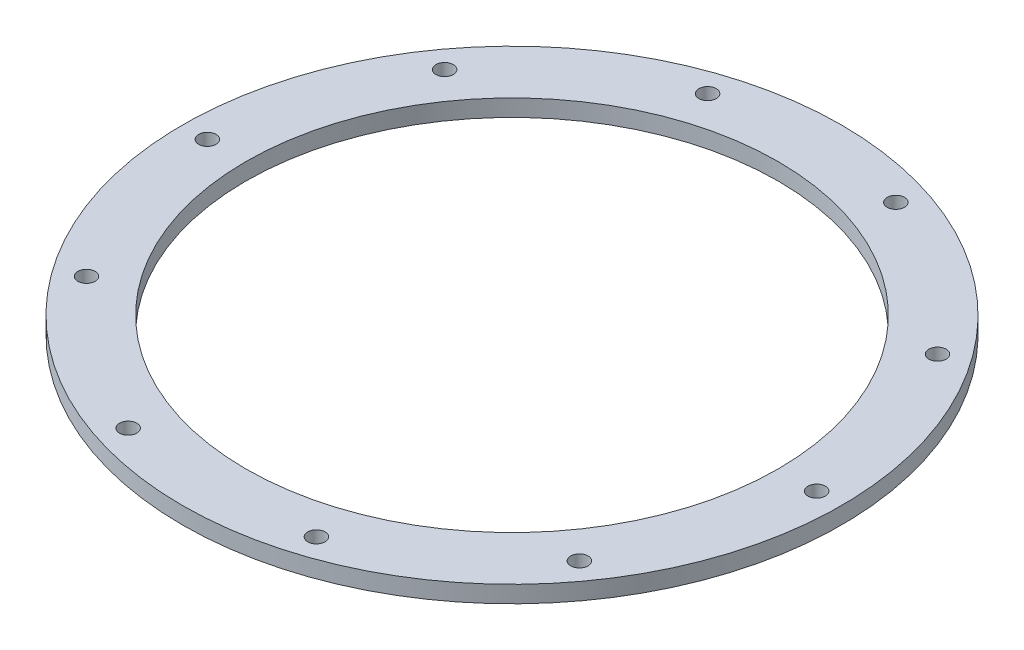
ISO-10303-21;
HEADER;
FILE_DESCRIPTION(('STEP AP214'),'2;1');
FILE_NAME('part.step','',(''),(''),'','','');
FILE_SCHEMA(('AUTOMOTIVE_DESIGN { 1 0 10303 214 1 1 1 1 }'));
ENDSEC;
DATA;
#1=APPLICATION_CONTEXT('core data for automotive mechanical design processes');
#2=APPLICATION_PROTOCOL_DEFINITION('international standard','automotive_design',2000,#1);
#3=PRODUCT_CONTEXT('',#1,'mechanical');
#4=PRODUCT('Part','Part','',(#3));
#5=PRODUCT_RELATED_PRODUCT_CATEGORY('part','',(#4));
#6=PRODUCT_DEFINITION_FORMATION('','',#4);
#7=PRODUCT_DEFINITION_CONTEXT('part definition',#1,'design');
#8=PRODUCT_DEFINITION('design','',#6,#7);
#9=PRODUCT_DEFINITION_SHAPE('','',#8);
#10=(LENGTH_UNIT() NAMED_UNIT(*) SI_UNIT(.MILLI.,.METRE.));
#11=(NAMED_UNIT(*) PLANE_ANGLE_UNIT() SI_UNIT($,.RADIAN.));
#12=(NAMED_UNIT(*) SI_UNIT($,.STERADIAN.) SOLID_ANGLE_UNIT());
#13=UNCERTAINTY_MEASURE_WITH_UNIT(LENGTH_MEASURE(1.E-05),#10,'distance_accuracy_value','');
#14=(GEOMETRIC_REPRESENTATION_CONTEXT(3) GLOBAL_UNCERTAINTY_ASSIGNED_CONTEXT((#13)) GLOBAL_UNIT_ASSIGNED_CONTEXT((#10,
#11,#12)) REPRESENTATION_CONTEXT('',''));
#15=CARTESIAN_POINT('',(0.,0.,0.));
#16=DIRECTION('',(0.,0.,1.));
#17=DIRECTION('',(1.,0.,0.));
#18=AXIS2_PLACEMENT_3D('',#15,#16,#17);
#19=CARTESIAN_POINT('',(0.,4.,0.));
#20=DIRECTION('',(0.,1.,0.));
#21=DIRECTION('',(0.,0.,1.));
#22=AXIS2_PLACEMENT_3D('',#19,#20,#21);
#23=PLANE('',#22);
#24=CARTESIAN_POINT('',(-58.3301252944343,4.,42.3793166902865));
#25=DIRECTION('',(0.,1.,0.));
#26=DIRECTION('',(0.587785252292462,0.,0.809016994374955));
#27=AXIS2_PLACEMENT_3D('',#24,#25,#26);
#28=CIRCLE('',#27,2.04999999999999);
#29=CARTESIAN_POINT('',(-57.1251655272347,4.,44.0378015287552));
#30=VERTEX_POINT('',#29);
#31=EDGE_CURVE('E63',#30,#30,#28,.T.);
#32=ORIENTED_EDGE('',*,*,#31,.F.);
#33=EDGE_LOOP('',(#32));
#34=FACE_BOUND('',#33,.T.);
#35=CARTESIAN_POINT('',(-22.2801252944345,4.,68.5711748248803));
#36=DIRECTION('',(0.,1.,0.));
#37=DIRECTION('',(0.95105651629515,0.,0.309016994374958));
#38=AXIS2_PLACEMENT_3D('',#35,#36,#37);
#39=CIRCLE('',#38,2.04999999999999);
#40=CARTESIAN_POINT('',(-20.3304594360294,4.,69.204659663349));
#41=VERTEX_POINT('',#40);
#42=EDGE_CURVE('E69',#41,#41,#39,.T.);
#43=ORIENTED_EDGE('',*,*,#42,.F.);
#44=EDGE_LOOP('',(#43));
#45=FACE_BOUND('',#44,.T.);
#46=CARTESIAN_POINT('',(22.280125294433,4.,68.5711748248808));
#47=DIRECTION('',(0.,1.,0.));
#48=DIRECTION('',(0.951056516295157,0.,-0.309016994374938));
#49=AXIS2_PLACEMENT_3D('',#46,#47,#48);
#50=CIRCLE('',#49,2.04999999999999);
#51=CARTESIAN_POINT('',(24.2297911528381,4.,67.9376899864122));
#52=VERTEX_POINT('',#51);
#53=EDGE_CURVE('E75',#52,#52,#50,.T.);
#54=ORIENTED_EDGE('',*,*,#53,.F.);
#55=EDGE_LOOP('',(#54));
#56=FACE_BOUND('',#55,.T.);
#57=CARTESIAN_POINT('',(58.3301252944333,4.,42.3793166902878));
#58=DIRECTION('',(0.,1.,0.));
#59=DIRECTION('',(0.58778525229248,0.,-0.809016994374942));
#60=AXIS2_PLACEMENT_3D('',#57,#58,#59);
#61=CIRCLE('',#60,2.04999999999999);
#62=CARTESIAN_POINT('',(59.5350850616329,4.,40.7208318518192));
#63=VERTEX_POINT('',#62);
#64=EDGE_CURVE('E81',#63,#63,#61,.T.);
#65=ORIENTED_EDGE('',*,*,#64,.F.);
#66=EDGE_LOOP('',(#65));
#67=FACE_BOUND('',#66,.T.);
#68=CARTESIAN_POINT('',(72.1,4.,0.));
#69=DIRECTION('',(0.,1.,0.));
#70=DIRECTION('',(0.,0.,-1.));
#71=AXIS2_PLACEMENT_3D('',#68,#69,#70);
#72=CIRCLE('',#71,2.04999999999999);
#73=CARTESIAN_POINT('',(72.1,4.,-2.04999999999999));
#74=VERTEX_POINT('',#73);
#75=EDGE_CURVE('E87',#74,#74,#72,.T.);
#76=ORIENTED_EDGE('',*,*,#75,.F.);
#77=EDGE_LOOP('',(#76));
#78=FACE_BOUND('',#77,.T.);
#79=CARTESIAN_POINT('',(58.3301252944339,4.,-42.379316690287));
#80=DIRECTION('',(0.,1.,0.));
#81=DIRECTION('',(-0.587785252292469,0.,-0.809016994374951));
#82=AXIS2_PLACEMENT_3D('',#79,#80,#81);
#83=CIRCLE('',#82,2.04999999999999);
#84=CARTESIAN_POINT('',(57.1251655272344,4.,-44.0378015287556));
#85=VERTEX_POINT('',#84);
#86=EDGE_CURVE('E93',#85,#85,#83,.T.);
#87=ORIENTED_EDGE('',*,*,#86,.F.);
#88=EDGE_LOOP('',(#87));
#89=FACE_BOUND('',#88,.T.);
#90=CARTESIAN_POINT('',(22.280125294434,4.,-68.5711748248805));
#91=DIRECTION('',(0.,1.,0.));
#92=DIRECTION('',(-0.951056516295152,0.,-0.309016994374952));
#93=AXIS2_PLACEMENT_3D('',#90,#91,#92);
#94=CIRCLE('',#93,2.04999999999999);
#95=CARTESIAN_POINT('',(20.330459436029,4.,-69.2046596633491));
#96=VERTEX_POINT('',#95);
#97=EDGE_CURVE('E99',#96,#96,#94,.T.);
#98=ORIENTED_EDGE('',*,*,#97,.F.);
#99=EDGE_LOOP('',(#98));
#100=FACE_BOUND('',#99,.T.);
#101=CARTESIAN_POINT('',(-22.2801252944335,4.,-68.5711748248806));
#102=DIRECTION('',(0.,1.,0.));
#103=DIRECTION('',(-0.951056516295155,0.,0.309016994374945));
#104=AXIS2_PLACEMENT_3D('',#101,#102,#103);
#105=CIRCLE('',#104,2.04999999999999);
#106=CARTESIAN_POINT('',(-24.2297911528386,4.,-67.937689986412));
#107=VERTEX_POINT('',#106);
#108=EDGE_CURVE('E105',#107,#107,#105,.T.);
#109=ORIENTED_EDGE('',*,*,#108,.F.);
#110=EDGE_LOOP('',(#109));
#111=FACE_BOUND('',#110,.T.);
#112=CARTESIAN_POINT('',(-58.3301252944337,4.,-42.3793166902874));
#113=DIRECTION('',(0.,1.,0.));
#114=DIRECTION('',(-0.587785252292474,0.,0.809016994374947));
#115=AXIS2_PLACEMENT_3D('',#112,#113,#114);
#116=CIRCLE('',#115,2.04999999999999);
#117=CARTESIAN_POINT('',(-59.5350850616332,4.,-40.7208318518188));
#118=VERTEX_POINT('',#117);
#119=EDGE_CURVE('E57',#118,#118,#116,.T.);
#120=ORIENTED_EDGE('',*,*,#119,.F.);
#121=EDGE_LOOP('',(#120));
#122=FACE_BOUND('',#121,.T.);
#123=CARTESIAN_POINT('',(-72.1,4.,0.));
#124=DIRECTION('',(0.,1.,0.));
#125=DIRECTION('',(0.,0.,1.));
#126=AXIS2_PLACEMENT_3D('',#123,#124,#125);
#127=CIRCLE('',#126,2.04999999999999);
#128=CARTESIAN_POINT('',(-72.1,4.,2.04999999999999));
#129=VERTEX_POINT('',#128);
#130=EDGE_CURVE('E51',#129,#129,#127,.T.);
#131=ORIENTED_EDGE('',*,*,#130,.F.);
#132=EDGE_LOOP('',(#131));
#133=FACE_BOUND('',#132,.T.);
#134=CARTESIAN_POINT('',(0.,4.,0.));
#135=DIRECTION('',(0.,1.,0.));
#136=DIRECTION('',(0.,0.,1.));
#137=AXIS2_PLACEMENT_3D('',#134,#135,#136);
#138=CIRCLE('',#137,78.);
#139=CARTESIAN_POINT('',(0.,4.,78.));
#140=VERTEX_POINT('',#139);
#141=EDGE_CURVE('E10',#140,#140,#138,.T.);
#142=ORIENTED_EDGE('',*,*,#141,.T.);
#143=EDGE_LOOP('',(#142));
#144=FACE_BOUND('',#143,.T.);
#145=CARTESIAN_POINT('',(0.,4.,0.));
#146=DIRECTION('',(0.,1.,0.));
#147=DIRECTION('',(0.,0.,1.));
#148=AXIS2_PLACEMENT_3D('',#145,#146,#147);
#149=CIRCLE('',#148,63.);
#150=CARTESIAN_POINT('',(0.,4.,63.));
#151=VERTEX_POINT('',#150);
#152=EDGE_CURVE('E43',#151,#151,#149,.T.);
#153=ORIENTED_EDGE('',*,*,#152,.F.);
#154=EDGE_LOOP('',(#153));
#155=FACE_BOUND('',#154,.T.);
#156=ADVANCED_FACE('F32',(#34,#45,#56,#67,#78,#89,#100,#111,#122,#133,#144,#155),#23,.T.);
#157=CARTESIAN_POINT('',(0.,0.,0.));
#158=DIRECTION('',(0.,1.,0.));
#159=DIRECTION('',(0.,0.,1.));
#160=AXIS2_PLACEMENT_3D('',#157,#158,#159);
#161=PLANE('',#160);
#162=CARTESIAN_POINT('',(-58.3301252944343,0.,42.3793166902865));
#163=DIRECTION('',(0.,1.,0.));
#164=DIRECTION('',(0.587785252292462,0.,0.809016994374955));
#165=AXIS2_PLACEMENT_3D('',#162,#163,#164);
#166=CIRCLE('',#165,2.04999999999999);
#167=CARTESIAN_POINT('',(-57.1251655272347,0.,44.0378015287552));
#168=VERTEX_POINT('',#167);
#169=EDGE_CURVE('E66',#168,#168,#166,.T.);
#170=ORIENTED_EDGE('',*,*,#169,.T.);
#171=EDGE_LOOP('',(#170));
#172=FACE_BOUND('',#171,.T.);
#173=CARTESIAN_POINT('',(-22.2801252944345,0.,68.5711748248803));
#174=DIRECTION('',(0.,1.,0.));
#175=DIRECTION('',(0.95105651629515,0.,0.309016994374958));
#176=AXIS2_PLACEMENT_3D('',#173,#174,#175);
#177=CIRCLE('',#176,2.04999999999999);
#178=CARTESIAN_POINT('',(-20.3304594360294,0.,69.204659663349));
#179=VERTEX_POINT('',#178);
#180=EDGE_CURVE('E72',#179,#179,#177,.T.);
#181=ORIENTED_EDGE('',*,*,#180,.T.);
#182=EDGE_LOOP('',(#181));
#183=FACE_BOUND('',#182,.T.);
#184=CARTESIAN_POINT('',(22.280125294433,0.,68.5711748248808));
#185=DIRECTION('',(0.,1.,0.));
#186=DIRECTION('',(0.951056516295157,0.,-0.309016994374938));
#187=AXIS2_PLACEMENT_3D('',#184,#185,#186);
#188=CIRCLE('',#187,2.04999999999999);
#189=CARTESIAN_POINT('',(24.2297911528381,0.,67.9376899864122));
#190=VERTEX_POINT('',#189);
#191=EDGE_CURVE('E78',#190,#190,#188,.T.);
#192=ORIENTED_EDGE('',*,*,#191,.T.);
#193=EDGE_LOOP('',(#192));
#194=FACE_BOUND('',#193,.T.);
#195=CARTESIAN_POINT('',(58.3301252944333,0.,42.3793166902878));
#196=DIRECTION('',(0.,1.,0.));
#197=DIRECTION('',(0.58778525229248,0.,-0.809016994374942));
#198=AXIS2_PLACEMENT_3D('',#195,#196,#197);
#199=CIRCLE('',#198,2.04999999999999);
#200=CARTESIAN_POINT('',(59.5350850616329,0.,40.7208318518192));
#201=VERTEX_POINT('',#200);
#202=EDGE_CURVE('E84',#201,#201,#199,.T.);
#203=ORIENTED_EDGE('',*,*,#202,.T.);
#204=EDGE_LOOP('',(#203));
#205=FACE_BOUND('',#204,.T.);
#206=CARTESIAN_POINT('',(72.1,0.,0.));
#207=DIRECTION('',(0.,1.,0.));
#208=DIRECTION('',(0.,0.,-1.));
#209=AXIS2_PLACEMENT_3D('',#206,#207,#208);
#210=CIRCLE('',#209,2.04999999999999);
#211=CARTESIAN_POINT('',(72.1,0.,-2.04999999999999));
#212=VERTEX_POINT('',#211);
#213=EDGE_CURVE('E90',#212,#212,#210,.T.);
#214=ORIENTED_EDGE('',*,*,#213,.T.);
#215=EDGE_LOOP('',(#214));
#216=FACE_BOUND('',#215,.T.);
#217=CARTESIAN_POINT('',(58.3301252944339,0.,-42.379316690287));
#218=DIRECTION('',(0.,1.,0.));
#219=DIRECTION('',(-0.587785252292469,0.,-0.809016994374951));
#220=AXIS2_PLACEMENT_3D('',#217,#218,#219);
#221=CIRCLE('',#220,2.04999999999999);
#222=CARTESIAN_POINT('',(57.1251655272344,0.,-44.0378015287556));
#223=VERTEX_POINT('',#222);
#224=EDGE_CURVE('E96',#223,#223,#221,.T.);
#225=ORIENTED_EDGE('',*,*,#224,.T.);
#226=EDGE_LOOP('',(#225));
#227=FACE_BOUND('',#226,.T.);
#228=CARTESIAN_POINT('',(22.280125294434,0.,-68.5711748248805));
#229=DIRECTION('',(0.,1.,0.));
#230=DIRECTION('',(-0.951056516295152,0.,-0.309016994374952));
#231=AXIS2_PLACEMENT_3D('',#228,#229,#230);
#232=CIRCLE('',#231,2.04999999999999);
#233=CARTESIAN_POINT('',(20.330459436029,0.,-69.2046596633491));
#234=VERTEX_POINT('',#233);
#235=EDGE_CURVE('E102',#234,#234,#232,.T.);
#236=ORIENTED_EDGE('',*,*,#235,.T.);
#237=EDGE_LOOP('',(#236));
#238=FACE_BOUND('',#237,.T.);
#239=CARTESIAN_POINT('',(-22.2801252944335,0.,-68.5711748248806));
#240=DIRECTION('',(0.,1.,0.));
#241=DIRECTION('',(-0.951056516295155,0.,0.309016994374945));
#242=AXIS2_PLACEMENT_3D('',#239,#240,#241);
#243=CIRCLE('',#242,2.04999999999999);
#244=CARTESIAN_POINT('',(-24.2297911528386,0.,-67.937689986412));
#245=VERTEX_POINT('',#244);
#246=EDGE_CURVE('E60',#245,#245,#243,.T.);
#247=ORIENTED_EDGE('',*,*,#246,.T.);
#248=EDGE_LOOP('',(#247));
#249=FACE_BOUND('',#248,.T.);
#250=CARTESIAN_POINT('',(-58.3301252944337,0.,-42.3793166902874));
#251=DIRECTION('',(0.,1.,0.));
#252=DIRECTION('',(-0.587785252292474,0.,0.809016994374947));
#253=AXIS2_PLACEMENT_3D('',#250,#251,#252);
#254=CIRCLE('',#253,2.04999999999999);
#255=CARTESIAN_POINT('',(-59.5350850616332,0.,-40.7208318518188));
#256=VERTEX_POINT('',#255);
#257=EDGE_CURVE('E54',#256,#256,#254,.T.);
#258=ORIENTED_EDGE('',*,*,#257,.T.);
#259=EDGE_LOOP('',(#258));
#260=FACE_BOUND('',#259,.T.);
#261=CARTESIAN_POINT('',(-72.1,0.,0.));
#262=DIRECTION('',(0.,1.,0.));
#263=DIRECTION('',(0.,0.,1.));
#264=AXIS2_PLACEMENT_3D('',#261,#262,#263);
#265=CIRCLE('',#264,2.04999999999999);
#266=CARTESIAN_POINT('',(-72.1,0.,2.04999999999999));
#267=VERTEX_POINT('',#266);
#268=EDGE_CURVE('E48',#267,#267,#265,.T.);
#269=ORIENTED_EDGE('',*,*,#268,.T.);
#270=EDGE_LOOP('',(#269));
#271=FACE_BOUND('',#270,.T.);
#272=CARTESIAN_POINT('',(0.,0.,0.));
#273=DIRECTION('',(0.,1.,0.));
#274=DIRECTION('',(0.,0.,1.));
#275=AXIS2_PLACEMENT_3D('',#272,#273,#274);
#276=CIRCLE('',#275,78.);
#277=CARTESIAN_POINT('',(0.,0.,78.));
#278=VERTEX_POINT('',#277);
#279=EDGE_CURVE('E36',#278,#278,#276,.T.);
#280=ORIENTED_EDGE('',*,*,#279,.F.);
#281=EDGE_LOOP('',(#280));
#282=FACE_BOUND('',#281,.T.);
#283=CARTESIAN_POINT('',(0.,0.,0.));
#284=DIRECTION('',(0.,1.,0.));
#285=DIRECTION('',(0.,0.,1.));
#286=AXIS2_PLACEMENT_3D('',#283,#284,#285);
#287=CIRCLE('',#286,63.);
#288=CARTESIAN_POINT('',(0.,0.,63.));
#289=VERTEX_POINT('',#288);
#290=EDGE_CURVE('E45',#289,#289,#287,.T.);
#291=ORIENTED_EDGE('',*,*,#290,.T.);
#292=EDGE_LOOP('',(#291));
#293=FACE_BOUND('',#292,.T.);
#294=ADVANCED_FACE('F111',(#172,#183,#194,#205,#216,#227,#238,#249,#260,#271,#282,#293),#161,.F.);
#295=CARTESIAN_POINT('',(0.,4.,0.));
#296=DIRECTION('',(0.,-1.,0.));
#297=DIRECTION('',(0.,0.,-1.));
#298=AXIS2_PLACEMENT_3D('',#295,#296,#297);
#299=CYLINDRICAL_SURFACE('',#298,78.);
#300=ORIENTED_EDGE('',*,*,#141,.F.);
#301=EDGE_LOOP('',(#300));
#302=FACE_BOUND('',#301,.T.);
#303=ORIENTED_EDGE('',*,*,#279,.T.);
#304=EDGE_LOOP('',(#303));
#305=FACE_BOUND('',#304,.T.);
#306=ADVANCED_FACE('F34',(#302,#305),#299,.T.);
#307=CARTESIAN_POINT('',(0.,4.,0.));
#308=DIRECTION('',(0.,-1.,0.));
#309=DIRECTION('',(0.,0.,-1.));
#310=AXIS2_PLACEMENT_3D('',#307,#308,#309);
#311=CYLINDRICAL_SURFACE('',#310,63.);
#312=ORIENTED_EDGE('',*,*,#152,.T.);
#313=EDGE_LOOP('',(#312));
#314=FACE_BOUND('',#313,.T.);
#315=ORIENTED_EDGE('',*,*,#290,.F.);
#316=EDGE_LOOP('',(#315));
#317=FACE_BOUND('',#316,.T.);
#318=ADVANCED_FACE('F132',(#314,#317),#311,.F.);
#319=CARTESIAN_POINT('',(-72.1,0.,0.));
#320=DIRECTION('',(0.,1.,0.));
#321=DIRECTION('',(0.,0.,1.));
#322=AXIS2_PLACEMENT_3D('',#319,#320,#321);
#323=CYLINDRICAL_SURFACE('',#322,2.04999999999999);
#324=ORIENTED_EDGE('',*,*,#268,.F.);
#325=EDGE_LOOP('',(#324));
#326=FACE_BOUND('',#325,.T.);
#327=ORIENTED_EDGE('',*,*,#130,.T.);
#328=EDGE_LOOP('',(#327));
#329=FACE_BOUND('',#328,.T.);
#330=ADVANCED_FACE('F135',(#326,#329),#323,.F.);
#331=CARTESIAN_POINT('',(-58.3301252944337,0.,-42.3793166902874));
#332=DIRECTION('',(0.,1.,0.));
#333=DIRECTION('',(0.,0.,1.));
#334=AXIS2_PLACEMENT_3D('',#331,#332,#333);
#335=CYLINDRICAL_SURFACE('',#334,2.04999999999999);
#336=ORIENTED_EDGE('',*,*,#257,.F.);
#337=EDGE_LOOP('',(#336));
#338=FACE_BOUND('',#337,.T.);
#339=ORIENTED_EDGE('',*,*,#119,.T.);
#340=EDGE_LOOP('',(#339));
#341=FACE_BOUND('',#340,.T.);
#342=ADVANCED_FACE('F118',(#338,#341),#335,.F.);
#343=CARTESIAN_POINT('',(-22.2801252944335,0.,-68.5711748248806));
#344=DIRECTION('',(0.,1.,0.));
#345=DIRECTION('',(0.,0.,1.));
#346=AXIS2_PLACEMENT_3D('',#343,#344,#345);
#347=CYLINDRICAL_SURFACE('',#346,2.04999999999999);
#348=ORIENTED_EDGE('',*,*,#246,.F.);
#349=EDGE_LOOP('',(#348));
#350=FACE_BOUND('',#349,.T.);
#351=ORIENTED_EDGE('',*,*,#108,.T.);
#352=EDGE_LOOP('',(#351));
#353=FACE_BOUND('',#352,.T.);
#354=ADVANCED_FACE('F114',(#350,#353),#347,.F.);
#355=CARTESIAN_POINT('',(22.280125294434,0.,-68.5711748248805));
#356=DIRECTION('',(0.,1.,0.));
#357=DIRECTION('',(0.,0.,1.));
#358=AXIS2_PLACEMENT_3D('',#355,#356,#357);
#359=CYLINDRICAL_SURFACE('',#358,2.04999999999999);
#360=ORIENTED_EDGE('',*,*,#235,.F.);
#361=EDGE_LOOP('',(#360));
#362=FACE_BOUND('',#361,.T.);
#363=ORIENTED_EDGE('',*,*,#97,.T.);
#364=EDGE_LOOP('',(#363));
#365=FACE_BOUND('',#364,.T.);
#366=ADVANCED_FACE('F117',(#362,#365),#359,.F.);
#367=CARTESIAN_POINT('',(58.3301252944339,0.,-42.379316690287));
#368=DIRECTION('',(0.,1.,0.));
#369=DIRECTION('',(0.,0.,1.));
#370=AXIS2_PLACEMENT_3D('',#367,#368,#369);
#371=CYLINDRICAL_SURFACE('',#370,2.04999999999999);
#372=ORIENTED_EDGE('',*,*,#224,.F.);
#373=EDGE_LOOP('',(#372));
#374=FACE_BOUND('',#373,.T.);
#375=ORIENTED_EDGE('',*,*,#86,.T.);
#376=EDGE_LOOP('',(#375));
#377=FACE_BOUND('',#376,.T.);
#378=ADVANCED_FACE('F172',(#374,#377),#371,.F.);
#379=CARTESIAN_POINT('',(72.1,0.,0.));
#380=DIRECTION('',(0.,1.,0.));
#381=DIRECTION('',(0.,0.,1.));
#382=AXIS2_PLACEMENT_3D('',#379,#380,#381);
#383=CYLINDRICAL_SURFACE('',#382,2.04999999999999);
#384=ORIENTED_EDGE('',*,*,#213,.F.);
#385=EDGE_LOOP('',(#384));
#386=FACE_BOUND('',#385,.T.);
#387=ORIENTED_EDGE('',*,*,#75,.T.);
#388=EDGE_LOOP('',(#387));
#389=FACE_BOUND('',#388,.T.);
#390=ADVANCED_FACE('F168',(#386,#389),#383,.F.);
#391=CARTESIAN_POINT('',(58.3301252944333,0.,42.3793166902878));
#392=DIRECTION('',(0.,1.,0.));
#393=DIRECTION('',(0.,0.,1.));
#394=AXIS2_PLACEMENT_3D('',#391,#392,#393);
#395=CYLINDRICAL_SURFACE('',#394,2.04999999999999);
#396=ORIENTED_EDGE('',*,*,#202,.F.);
#397=EDGE_LOOP('',(#396));
#398=FACE_BOUND('',#397,.T.);
#399=ORIENTED_EDGE('',*,*,#64,.T.);
#400=EDGE_LOOP('',(#399));
#401=FACE_BOUND('',#400,.T.);
#402=ADVANCED_FACE('F164',(#398,#401),#395,.F.);
#403=CARTESIAN_POINT('',(22.280125294433,0.,68.5711748248808));
#404=DIRECTION('',(0.,1.,0.));
#405=DIRECTION('',(0.,0.,1.));
#406=AXIS2_PLACEMENT_3D('',#403,#404,#405);
#407=CYLINDRICAL_SURFACE('',#406,2.04999999999999);
#408=ORIENTED_EDGE('',*,*,#191,.F.);
#409=EDGE_LOOP('',(#408));
#410=FACE_BOUND('',#409,.T.);
#411=ORIENTED_EDGE('',*,*,#53,.T.);
#412=EDGE_LOOP('',(#411));
#413=FACE_BOUND('',#412,.T.);
#414=ADVANCED_FACE('F160',(#410,#413),#407,.F.);
#415=CARTESIAN_POINT('',(-22.2801252944345,0.,68.5711748248803));
#416=DIRECTION('',(0.,1.,0.));
#417=DIRECTION('',(0.,0.,1.));
#418=AXIS2_PLACEMENT_3D('',#415,#416,#417);
#419=CYLINDRICAL_SURFACE('',#418,2.04999999999999);
#420=ORIENTED_EDGE('',*,*,#180,.F.);
#421=EDGE_LOOP('',(#420));
#422=FACE_BOUND('',#421,.T.);
#423=ORIENTED_EDGE('',*,*,#42,.T.);
#424=EDGE_LOOP('',(#423));
#425=FACE_BOUND('',#424,.T.);
#426=ADVANCED_FACE('F156',(#422,#425),#419,.F.);
#427=CARTESIAN_POINT('',(-58.3301252944343,0.,42.3793166902865));
#428=DIRECTION('',(0.,1.,0.));
#429=DIRECTION('',(0.,0.,1.));
#430=AXIS2_PLACEMENT_3D('',#427,#428,#429);
#431=CYLINDRICAL_SURFACE('',#430,2.04999999999999);
#432=ORIENTED_EDGE('',*,*,#169,.F.);
#433=EDGE_LOOP('',(#432));
#434=FACE_BOUND('',#433,.T.);
#435=ORIENTED_EDGE('',*,*,#31,.T.);
#436=EDGE_LOOP('',(#435));
#437=FACE_BOUND('',#436,.T.);
#438=ADVANCED_FACE('F153',(#434,#437),#431,.F.);
#439=CLOSED_SHELL('',(#156,#294,#306,#318,#330,#342,#354,#366,#378,#390,#402,#414,#426,#438));
#440=MANIFOLD_SOLID_BREP('B2',#439);
#441=ADVANCED_BREP_SHAPE_REPRESENTATION('',(#18,#440),#14);
#442=SHAPE_DEFINITION_REPRESENTATION(#9,#441);
ENDSEC;
END-ISO-10303-21;
